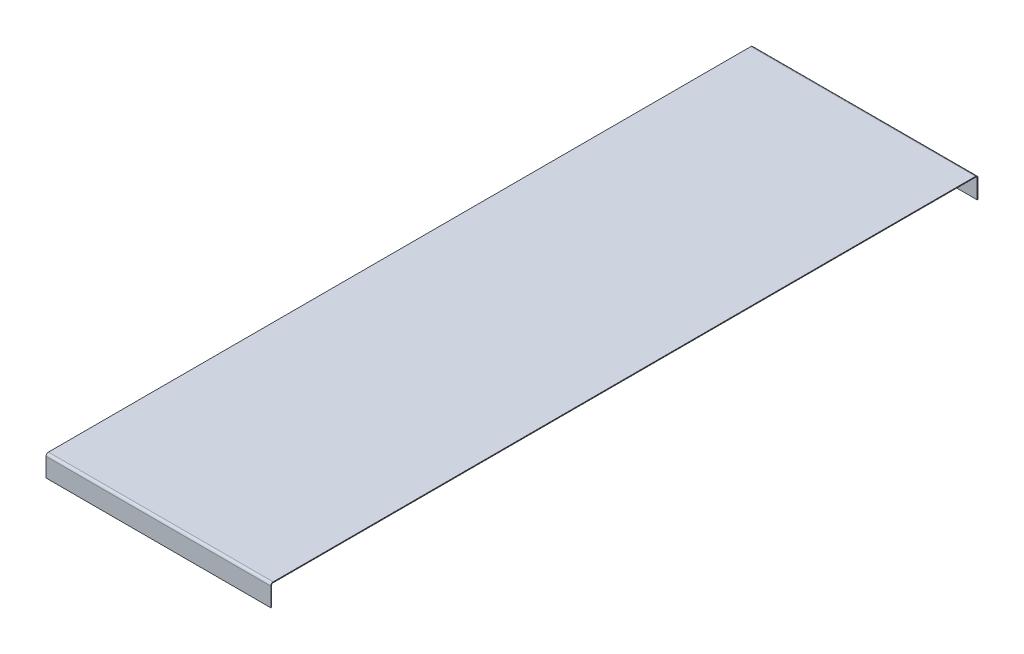
ISO-10303-21;
HEADER;
FILE_DESCRIPTION(('STEP AP214'),'2;1');
FILE_NAME('part.step','',(''),(''),'','','');
FILE_SCHEMA(('AUTOMOTIVE_DESIGN { 1 0 10303 214 1 1 1 1 }'));
ENDSEC;
DATA;
#1=APPLICATION_CONTEXT('core data for automotive mechanical design processes');
#2=APPLICATION_PROTOCOL_DEFINITION('international standard','automotive_design',2000,#1);
#3=PRODUCT_CONTEXT('',#1,'mechanical');
#4=PRODUCT('Part','Part','',(#3));
#5=PRODUCT_RELATED_PRODUCT_CATEGORY('part','',(#4));
#6=PRODUCT_DEFINITION_FORMATION('','',#4);
#7=PRODUCT_DEFINITION_CONTEXT('part definition',#1,'design');
#8=PRODUCT_DEFINITION('design','',#6,#7);
#9=PRODUCT_DEFINITION_SHAPE('','',#8);
#10=(LENGTH_UNIT() NAMED_UNIT(*) SI_UNIT(.MILLI.,.METRE.));
#11=(NAMED_UNIT(*) PLANE_ANGLE_UNIT() SI_UNIT($,.RADIAN.));
#12=(NAMED_UNIT(*) SI_UNIT($,.STERADIAN.) SOLID_ANGLE_UNIT());
#13=UNCERTAINTY_MEASURE_WITH_UNIT(LENGTH_MEASURE(1.E-05),#10,'distance_accuracy_value','');
#14=(GEOMETRIC_REPRESENTATION_CONTEXT(3) GLOBAL_UNCERTAINTY_ASSIGNED_CONTEXT((#13)) GLOBAL_UNIT_ASSIGNED_CONTEXT((#10,
#11,#12)) REPRESENTATION_CONTEXT('',''));
#15=CARTESIAN_POINT('',(0.,0.,0.));
#16=DIRECTION('',(0.,0.,1.));
#17=DIRECTION('',(1.,0.,0.));
#18=AXIS2_PLACEMENT_3D('',#15,#16,#17);
#19=CARTESIAN_POINT('',(0.,0.,0.));
#20=DIRECTION('',(0.,1.,0.));
#21=DIRECTION('',(0.,0.,1.));
#22=AXIS2_PLACEMENT_3D('',#19,#20,#21);
#23=PLANE('',#22);
#24=DIRECTION('',(0.,0.,1.));
#25=VECTOR('',#24,1.);
#26=CARTESIAN_POINT('',(104.619110259805,0.,147.476095846595));
#27=LINE('',#26,#25);
#28=CARTESIAN_POINT('',(104.619110259805,0.,-290.633904153406));
#29=VERTEX_POINT('',#28);
#30=CARTESIAN_POINT('',(104.619110259805,0.,145.976095846595));
#31=VERTEX_POINT('',#30);
#32=EDGE_CURVE('E174',#29,#31,#27,.T.);
#33=ORIENTED_EDGE('',*,*,#32,.F.);
#34=DIRECTION('',(-1.,0.,0.));
#35=VECTOR('',#34,1.);
#36=CARTESIAN_POINT('',(244.319110259805,0.,-290.633904153406));
#37=LINE('',#36,#35);
#38=CARTESIAN_POINT('',(244.319110259805,0.,-290.633904153406));
#39=VERTEX_POINT('',#38);
#40=EDGE_CURVE('E208',#29,#39,#37,.F.);
#41=ORIENTED_EDGE('',*,*,#40,.T.);
#42=DIRECTION('',(0.,0.,-1.));
#43=VECTOR('',#42,1.);
#44=CARTESIAN_POINT('',(244.319110259805,0.,147.476095846595));
#45=LINE('',#44,#43);
#46=CARTESIAN_POINT('',(244.319110259805,0.,145.976095846595));
#47=VERTEX_POINT('',#46);
#48=EDGE_CURVE('E169',#47,#39,#45,.T.);
#49=ORIENTED_EDGE('',*,*,#48,.F.);
#50=DIRECTION('',(1.,0.,0.));
#51=VECTOR('',#50,1.);
#52=CARTESIAN_POINT('',(104.619110259805,0.,145.976095846595));
#53=LINE('',#52,#51);
#54=EDGE_CURVE('E189',#47,#31,#53,.F.);
#55=ORIENTED_EDGE('',*,*,#54,.T.);
#56=EDGE_LOOP('',(#33,#41,#49,#55));
#57=FACE_BOUND('',#56,.T.);
#58=ADVANCED_FACE('F36',(#57),#23,.F.);
#59=CARTESIAN_POINT('',(244.319110259805,0.5,147.476095846595));
#60=DIRECTION('',(-1.,0.,0.));
#61=DIRECTION('',(0.,0.,1.));
#62=AXIS2_PLACEMENT_3D('',#59,#60,#61);
#63=PLANE('',#62);
#64=DIRECTION('',(0.,-1.,0.));
#65=VECTOR('',#64,1.);
#66=CARTESIAN_POINT('',(244.319110259805,0.5,-292.133904153406));
#67=LINE('',#66,#65);
#68=CARTESIAN_POINT('',(244.319110259805,-1.,-292.133904153406));
#69=VERTEX_POINT('',#68);
#70=CARTESIAN_POINT('',(244.319110259805,-12.7,-292.133904153406));
#71=VERTEX_POINT('',#70);
#72=EDGE_CURVE('E184',#69,#71,#67,.T.);
#73=ORIENTED_EDGE('',*,*,#72,.F.);
#74=CARTESIAN_POINT('',(244.319110259805,-1.,-290.633904153406));
#75=DIRECTION('',(-1.,0.,0.));
#76=DIRECTION('',(0.,0.,1.));
#77=AXIS2_PLACEMENT_3D('',#74,#75,#76);
#78=CIRCLE('',#77,1.5);
#79=CARTESIAN_POINT('',(244.319110259805,0.5,-290.633904153406));
#80=VERTEX_POINT('',#79);
#81=EDGE_CURVE('E11',#69,#80,#78,.F.);
#82=ORIENTED_EDGE('',*,*,#81,.T.);
#83=DIRECTION('',(0.,0.,-1.));
#84=VECTOR('',#83,1.);
#85=CARTESIAN_POINT('',(244.319110259805,0.5,147.476095846595));
#86=LINE('',#85,#84);
#87=CARTESIAN_POINT('',(244.319110259805,0.5,145.976095846595));
#88=VERTEX_POINT('',#87);
#89=EDGE_CURVE('E170',#88,#80,#86,.T.);
#90=ORIENTED_EDGE('',*,*,#89,.F.);
#91=CARTESIAN_POINT('',(244.319110259805,-1.,145.976095846595));
#92=DIRECTION('',(-1.,0.,0.));
#93=DIRECTION('',(0.,0.,1.));
#94=AXIS2_PLACEMENT_3D('',#91,#92,#93);
#95=CIRCLE('',#94,1.5);
#96=CARTESIAN_POINT('',(244.319110259805,-1.,147.476095846595));
#97=VERTEX_POINT('',#96);
#98=EDGE_CURVE('E199',#88,#97,#95,.F.);
#99=ORIENTED_EDGE('',*,*,#98,.T.);
#100=DIRECTION('',(0.,-1.,0.));
#101=VECTOR('',#100,1.);
#102=CARTESIAN_POINT('',(244.319110259805,0.5,147.476095846595));
#103=LINE('',#102,#101);
#104=CARTESIAN_POINT('',(244.319110259805,-12.7,147.476095846595));
#105=VERTEX_POINT('',#104);
#106=EDGE_CURVE('E176',#97,#105,#103,.T.);
#107=ORIENTED_EDGE('',*,*,#106,.T.);
#108=DIRECTION('',(0.,0.,1.));
#109=VECTOR('',#108,1.);
#110=CARTESIAN_POINT('',(244.319110259805,-12.7,147.476095846595));
#111=LINE('',#110,#109);
#112=CARTESIAN_POINT('',(244.319110259805,-12.7,146.976095846595));
#113=VERTEX_POINT('',#112);
#114=EDGE_CURVE('E149',#113,#105,#111,.T.);
#115=ORIENTED_EDGE('',*,*,#114,.F.);
#116=DIRECTION('',(0.,1.,0.));
#117=VECTOR('',#116,1.);
#118=CARTESIAN_POINT('',(244.319110259805,-12.7,146.976095846595));
#119=LINE('',#118,#117);
#120=CARTESIAN_POINT('',(244.319110259805,-1.,146.976095846595));
#121=VERTEX_POINT('',#120);
#122=EDGE_CURVE('E163',#113,#121,#119,.T.);
#123=ORIENTED_EDGE('',*,*,#122,.T.);
#124=CARTESIAN_POINT('',(244.319110259805,-1.,145.976095846595));
#125=DIRECTION('',(-1.,0.,0.));
#126=DIRECTION('',(0.,0.,1.));
#127=AXIS2_PLACEMENT_3D('',#124,#125,#126);
#128=CIRCLE('',#127,1.);
#129=EDGE_CURVE('E192',#121,#47,#128,.T.);
#130=ORIENTED_EDGE('',*,*,#129,.T.);
#131=ORIENTED_EDGE('',*,*,#48,.T.);
#132=CARTESIAN_POINT('',(244.319110259805,-1.,-290.633904153406));
#133=DIRECTION('',(-1.,0.,0.));
#134=DIRECTION('',(0.,0.,1.));
#135=AXIS2_PLACEMENT_3D('',#132,#133,#134);
#136=CIRCLE('',#135,1.);
#137=CARTESIAN_POINT('',(244.319110259805,-1.,-291.633904153406));
#138=VERTEX_POINT('',#137);
#139=EDGE_CURVE('E148',#39,#138,#136,.T.);
#140=ORIENTED_EDGE('',*,*,#139,.T.);
#141=DIRECTION('',(0.,1.,0.));
#142=VECTOR('',#141,1.);
#143=CARTESIAN_POINT('',(244.319110259805,-12.7,-291.633904153406));
#144=LINE('',#143,#142);
#145=CARTESIAN_POINT('',(244.319110259805,-12.7,-291.633904153406));
#146=VERTEX_POINT('',#145);
#147=EDGE_CURVE('E128',#146,#138,#144,.T.);
#148=ORIENTED_EDGE('',*,*,#147,.F.);
#149=DIRECTION('',(0.,0.,1.));
#150=VECTOR('',#149,1.);
#151=CARTESIAN_POINT('',(244.319110259805,-12.7,-292.133904153406));
#152=LINE('',#151,#150);
#153=EDGE_CURVE('E136',#71,#146,#152,.T.);
#154=ORIENTED_EDGE('',*,*,#153,.F.);
#155=EDGE_LOOP('',(#73,#82,#90,#99,#107,#115,#123,#130,#131,#140,#148,#154));
#156=FACE_BOUND('',#155,.T.);
#157=ADVANCED_FACE('F145',(#156),#63,.F.);
#158=CARTESIAN_POINT('',(244.319110259805,0.5,-292.133904153406));
#159=DIRECTION('',(0.,0.,1.));
#160=DIRECTION('',(1.,0.,0.));
#161=AXIS2_PLACEMENT_3D('',#158,#159,#160);
#162=PLANE('',#161);
#163=DIRECTION('',(0.,-1.,0.));
#164=VECTOR('',#163,1.);
#165=CARTESIAN_POINT('',(104.619110259805,0.5,-292.133904153406));
#166=LINE('',#165,#164);
#167=CARTESIAN_POINT('',(104.619110259805,-1.,-292.133904153406));
#168=VERTEX_POINT('',#167);
#169=CARTESIAN_POINT('',(104.619110259805,-12.7,-292.133904153406));
#170=VERTEX_POINT('',#169);
#171=EDGE_CURVE('E182',#168,#170,#166,.T.);
#172=ORIENTED_EDGE('',*,*,#171,.F.);
#173=DIRECTION('',(-1.,0.,0.));
#174=VECTOR('',#173,1.);
#175=CARTESIAN_POINT('',(244.319110259805,-1.,-292.133904153406));
#176=LINE('',#175,#174);
#177=EDGE_CURVE('E44',#168,#69,#176,.F.);
#178=ORIENTED_EDGE('',*,*,#177,.T.);
#179=ORIENTED_EDGE('',*,*,#72,.T.);
#180=DIRECTION('',(1.,0.,0.));
#181=VECTOR('',#180,1.);
#182=CARTESIAN_POINT('',(244.319110259805,-12.7,-292.133904153406));
#183=LINE('',#182,#181);
#184=EDGE_CURVE('E142',#170,#71,#183,.T.);
#185=ORIENTED_EDGE('',*,*,#184,.F.);
#186=EDGE_LOOP('',(#172,#178,#179,#185));
#187=FACE_BOUND('',#186,.T.);
#188=ADVANCED_FACE('F243',(#187),#162,.F.);
#189=CARTESIAN_POINT('',(104.619110259805,0.5,147.476095846595));
#190=DIRECTION('',(1.,0.,0.));
#191=DIRECTION('',(0.,0.,-1.));
#192=AXIS2_PLACEMENT_3D('',#189,#190,#191);
#193=PLANE('',#192);
#194=DIRECTION('',(0.,0.,1.));
#195=VECTOR('',#194,1.);
#196=CARTESIAN_POINT('',(104.619110259805,0.5,147.476095846595));
#197=LINE('',#196,#195);
#198=CARTESIAN_POINT('',(104.619110259805,0.5,-290.633904153406));
#199=VERTEX_POINT('',#198);
#200=CARTESIAN_POINT('',(104.619110259805,0.5,145.976095846595));
#201=VERTEX_POINT('',#200);
#202=EDGE_CURVE('E173',#199,#201,#197,.T.);
#203=ORIENTED_EDGE('',*,*,#202,.F.);
#204=CARTESIAN_POINT('',(104.619110259805,-1.,-290.633904153406));
#205=DIRECTION('',(1.,0.,0.));
#206=DIRECTION('',(0.,0.,-1.));
#207=AXIS2_PLACEMENT_3D('',#204,#205,#206);
#208=CIRCLE('',#207,1.5);
#209=EDGE_CURVE('E58',#199,#168,#208,.F.);
#210=ORIENTED_EDGE('',*,*,#209,.T.);
#211=ORIENTED_EDGE('',*,*,#171,.T.);
#212=DIRECTION('',(0.,0.,-1.));
#213=VECTOR('',#212,1.);
#214=CARTESIAN_POINT('',(104.619110259805,-12.7,-292.133904153406));
#215=LINE('',#214,#213);
#216=CARTESIAN_POINT('',(104.619110259805,-12.7,-291.633904153406));
#217=VERTEX_POINT('',#216);
#218=EDGE_CURVE('E135',#217,#170,#215,.T.);
#219=ORIENTED_EDGE('',*,*,#218,.F.);
#220=DIRECTION('',(0.,1.,0.));
#221=VECTOR('',#220,1.);
#222=CARTESIAN_POINT('',(104.619110259805,-12.7,-291.633904153406));
#223=LINE('',#222,#221);
#224=CARTESIAN_POINT('',(104.619110259805,-1.,-291.633904153406));
#225=VERTEX_POINT('',#224);
#226=EDGE_CURVE('E131',#217,#225,#223,.T.);
#227=ORIENTED_EDGE('',*,*,#226,.T.);
#228=CARTESIAN_POINT('',(104.619110259805,-1.,-290.633904153406));
#229=DIRECTION('',(1.,0.,0.));
#230=DIRECTION('',(0.,0.,-1.));
#231=AXIS2_PLACEMENT_3D('',#228,#229,#230);
#232=CIRCLE('',#231,1.);
#233=EDGE_CURVE('E210',#225,#29,#232,.T.);
#234=ORIENTED_EDGE('',*,*,#233,.T.);
#235=ORIENTED_EDGE('',*,*,#32,.T.);
#236=CARTESIAN_POINT('',(104.619110259805,-1.,145.976095846595));
#237=DIRECTION('',(1.,0.,0.));
#238=DIRECTION('',(0.,0.,-1.));
#239=AXIS2_PLACEMENT_3D('',#236,#237,#238);
#240=CIRCLE('',#239,1.);
#241=CARTESIAN_POINT('',(104.619110259805,-1.,146.976095846595));
#242=VERTEX_POINT('',#241);
#243=EDGE_CURVE('E194',#31,#242,#240,.T.);
#244=ORIENTED_EDGE('',*,*,#243,.T.);
#245=DIRECTION('',(0.,1.,0.));
#246=VECTOR('',#245,1.);
#247=CARTESIAN_POINT('',(104.619110259805,-12.7,146.976095846595));
#248=LINE('',#247,#246);
#249=CARTESIAN_POINT('',(104.619110259805,-12.7,146.976095846595));
#250=VERTEX_POINT('',#249);
#251=EDGE_CURVE('E166',#250,#242,#248,.T.);
#252=ORIENTED_EDGE('',*,*,#251,.F.);
#253=DIRECTION('',(0.,0.,-1.));
#254=VECTOR('',#253,1.);
#255=CARTESIAN_POINT('',(104.619110259805,-12.7,147.476095846595));
#256=LINE('',#255,#254);
#257=CARTESIAN_POINT('',(104.619110259805,-12.7,147.476095846595));
#258=VERTEX_POINT('',#257);
#259=EDGE_CURVE('E159',#258,#250,#256,.T.);
#260=ORIENTED_EDGE('',*,*,#259,.F.);
#261=DIRECTION('',(0.,-1.,0.));
#262=VECTOR('',#261,1.);
#263=CARTESIAN_POINT('',(104.619110259805,0.5,147.476095846595));
#264=LINE('',#263,#262);
#265=CARTESIAN_POINT('',(104.619110259805,-1.,147.476095846595));
#266=VERTEX_POINT('',#265);
#267=EDGE_CURVE('E180',#266,#258,#264,.T.);
#268=ORIENTED_EDGE('',*,*,#267,.F.);
#269=CARTESIAN_POINT('',(104.619110259805,-1.,145.976095846595));
#270=DIRECTION('',(1.,0.,0.));
#271=DIRECTION('',(0.,0.,-1.));
#272=AXIS2_PLACEMENT_3D('',#269,#270,#271);
#273=CIRCLE('',#272,1.5);
#274=EDGE_CURVE('E203',#266,#201,#273,.F.);
#275=ORIENTED_EDGE('',*,*,#274,.T.);
#276=EDGE_LOOP('',(#203,#210,#211,#219,#227,#234,#235,#244,#252,#260,#268,#275));
#277=FACE_BOUND('',#276,.T.);
#278=ADVANCED_FACE('F222',(#277),#193,.F.);
#279=CARTESIAN_POINT('',(244.319110259805,0.5,147.476095846595));
#280=DIRECTION('',(0.,0.,-1.));
#281=DIRECTION('',(-1.,0.,0.));
#282=AXIS2_PLACEMENT_3D('',#279,#280,#281);
#283=PLANE('',#282);
#284=ORIENTED_EDGE('',*,*,#106,.F.);
#285=DIRECTION('',(1.,0.,0.));
#286=VECTOR('',#285,1.);
#287=CARTESIAN_POINT('',(104.619110259805,-1.,147.476095846595));
#288=LINE('',#287,#286);
#289=EDGE_CURVE('E201',#97,#266,#288,.F.);
#290=ORIENTED_EDGE('',*,*,#289,.T.);
#291=ORIENTED_EDGE('',*,*,#267,.T.);
#292=DIRECTION('',(-1.,0.,0.));
#293=VECTOR('',#292,1.);
#294=CARTESIAN_POINT('',(244.319110259805,-12.7,147.476095846595));
#295=LINE('',#294,#293);
#296=EDGE_CURVE('E152',#105,#258,#295,.T.);
#297=ORIENTED_EDGE('',*,*,#296,.F.);
#298=EDGE_LOOP('',(#284,#290,#291,#297));
#299=FACE_BOUND('',#298,.T.);
#300=ADVANCED_FACE('F249',(#299),#283,.F.);
#301=CARTESIAN_POINT('',(0.,0.5,0.));
#302=DIRECTION('',(0.,1.,0.));
#303=DIRECTION('',(0.,0.,1.));
#304=AXIS2_PLACEMENT_3D('',#301,#302,#303);
#305=PLANE('',#304);
#306=ORIENTED_EDGE('',*,*,#89,.T.);
#307=DIRECTION('',(-1.,0.,0.));
#308=VECTOR('',#307,1.);
#309=CARTESIAN_POINT('',(104.619110259805,0.5,-290.633904153406));
#310=LINE('',#309,#308);
#311=EDGE_CURVE('E213',#80,#199,#310,.T.);
#312=ORIENTED_EDGE('',*,*,#311,.T.);
#313=ORIENTED_EDGE('',*,*,#202,.T.);
#314=DIRECTION('',(1.,0.,0.));
#315=VECTOR('',#314,1.);
#316=CARTESIAN_POINT('',(244.319110259805,0.5,145.976095846595));
#317=LINE('',#316,#315);
#318=EDGE_CURVE('E196',#201,#88,#317,.T.);
#319=ORIENTED_EDGE('',*,*,#318,.T.);
#320=EDGE_LOOP('',(#306,#312,#313,#319));
#321=FACE_BOUND('',#320,.T.);
#322=ADVANCED_FACE('F218',(#321),#305,.T.);
#323=CARTESIAN_POINT('',(244.319110259805,-12.7,146.976095846595));
#324=DIRECTION('',(0.,0.,1.));
#325=DIRECTION('',(1.,0.,0.));
#326=AXIS2_PLACEMENT_3D('',#323,#324,#325);
#327=PLANE('',#326);
#328=ORIENTED_EDGE('',*,*,#251,.T.);
#329=DIRECTION('',(1.,0.,0.));
#330=VECTOR('',#329,1.);
#331=CARTESIAN_POINT('',(244.319110259805,-1.,146.976095846595));
#332=LINE('',#331,#330);
#333=EDGE_CURVE('E186',#242,#121,#332,.T.);
#334=ORIENTED_EDGE('',*,*,#333,.T.);
#335=ORIENTED_EDGE('',*,*,#122,.F.);
#336=DIRECTION('',(1.,0.,0.));
#337=VECTOR('',#336,1.);
#338=CARTESIAN_POINT('',(244.319110259805,-12.7,146.976095846595));
#339=LINE('',#338,#337);
#340=EDGE_CURVE('E161',#250,#113,#339,.T.);
#341=ORIENTED_EDGE('',*,*,#340,.F.);
#342=EDGE_LOOP('',(#328,#334,#335,#341));
#343=FACE_BOUND('',#342,.T.);
#344=ADVANCED_FACE('F273',(#343),#327,.F.);
#345=CARTESIAN_POINT('',(0.,-12.7,0.));
#346=DIRECTION('',(0.,1.,0.));
#347=DIRECTION('',(0.,0.,1.));
#348=AXIS2_PLACEMENT_3D('',#345,#346,#347);
#349=PLANE('',#348);
#350=ORIENTED_EDGE('',*,*,#114,.T.);
#351=ORIENTED_EDGE('',*,*,#296,.T.);
#352=ORIENTED_EDGE('',*,*,#259,.T.);
#353=ORIENTED_EDGE('',*,*,#340,.T.);
#354=EDGE_LOOP('',(#350,#351,#352,#353));
#355=FACE_BOUND('',#354,.T.);
#356=ADVANCED_FACE('F260',(#355),#349,.F.);
#357=CARTESIAN_POINT('',(244.319110259805,-1.,145.976095846595));
#358=DIRECTION('',(-1.,0.,0.));
#359=DIRECTION('',(0.,0.,1.));
#360=AXIS2_PLACEMENT_3D('',#357,#358,#359);
#361=CYLINDRICAL_SURFACE('',#360,1.);
#362=ORIENTED_EDGE('',*,*,#243,.F.);
#363=ORIENTED_EDGE('',*,*,#54,.F.);
#364=ORIENTED_EDGE('',*,*,#129,.F.);
#365=ORIENTED_EDGE('',*,*,#333,.F.);
#366=EDGE_LOOP('',(#362,#363,#364,#365));
#367=FACE_BOUND('',#366,.T.);
#368=ADVANCED_FACE('F257',(#367),#361,.F.);
#369=CARTESIAN_POINT('',(0.,-1.,145.976095846595));
#370=DIRECTION('',(-1.,0.,0.));
#371=DIRECTION('',(0.,0.,1.));
#372=AXIS2_PLACEMENT_3D('',#369,#370,#371);
#373=CYLINDRICAL_SURFACE('',#372,1.5);
#374=ORIENTED_EDGE('',*,*,#274,.F.);
#375=ORIENTED_EDGE('',*,*,#289,.F.);
#376=ORIENTED_EDGE('',*,*,#98,.F.);
#377=ORIENTED_EDGE('',*,*,#318,.F.);
#378=EDGE_LOOP('',(#374,#375,#376,#377));
#379=FACE_BOUND('',#378,.T.);
#380=ADVANCED_FACE('F229',(#379),#373,.T.);
#381=CARTESIAN_POINT('',(244.319110259805,-12.7,-291.633904153406));
#382=DIRECTION('',(0.,0.,-1.));
#383=DIRECTION('',(-1.,0.,0.));
#384=AXIS2_PLACEMENT_3D('',#381,#382,#383);
#385=PLANE('',#384);
#386=ORIENTED_EDGE('',*,*,#147,.T.);
#387=DIRECTION('',(-1.,0.,0.));
#388=VECTOR('',#387,1.);
#389=CARTESIAN_POINT('',(104.619110259805,-1.,-291.633904153406));
#390=LINE('',#389,#388);
#391=EDGE_CURVE('E206',#138,#225,#390,.T.);
#392=ORIENTED_EDGE('',*,*,#391,.T.);
#393=ORIENTED_EDGE('',*,*,#226,.F.);
#394=DIRECTION('',(-1.,0.,0.));
#395=VECTOR('',#394,1.);
#396=CARTESIAN_POINT('',(244.319110259805,-12.7,-291.633904153406));
#397=LINE('',#396,#395);
#398=EDGE_CURVE('E123',#146,#217,#397,.T.);
#399=ORIENTED_EDGE('',*,*,#398,.F.);
#400=EDGE_LOOP('',(#386,#392,#393,#399));
#401=FACE_BOUND('',#400,.T.);
#402=ADVANCED_FACE('F125',(#401),#385,.F.);
#403=CARTESIAN_POINT('',(0.,-12.7,0.));
#404=DIRECTION('',(0.,-1.,0.));
#405=DIRECTION('',(0.,0.,-1.));
#406=AXIS2_PLACEMENT_3D('',#403,#404,#405);
#407=PLANE('',#406);
#408=ORIENTED_EDGE('',*,*,#153,.T.);
#409=ORIENTED_EDGE('',*,*,#398,.T.);
#410=ORIENTED_EDGE('',*,*,#218,.T.);
#411=ORIENTED_EDGE('',*,*,#184,.T.);
#412=EDGE_LOOP('',(#408,#409,#410,#411));
#413=FACE_BOUND('',#412,.T.);
#414=ADVANCED_FACE('F140',(#413),#407,.T.);
#415=CARTESIAN_POINT('',(244.319110259805,-1.,-290.633904153406));
#416=DIRECTION('',(1.,0.,0.));
#417=DIRECTION('',(0.,0.,-1.));
#418=AXIS2_PLACEMENT_3D('',#415,#416,#417);
#419=CYLINDRICAL_SURFACE('',#418,1.);
#420=ORIENTED_EDGE('',*,*,#139,.F.);
#421=ORIENTED_EDGE('',*,*,#40,.F.);
#422=ORIENTED_EDGE('',*,*,#233,.F.);
#423=ORIENTED_EDGE('',*,*,#391,.F.);
#424=EDGE_LOOP('',(#420,#421,#422,#423));
#425=FACE_BOUND('',#424,.T.);
#426=ADVANCED_FACE('F232',(#425),#419,.F.);
#427=CARTESIAN_POINT('',(0.,-1.,-290.633904153406));
#428=DIRECTION('',(1.,0.,0.));
#429=DIRECTION('',(0.,0.,-1.));
#430=AXIS2_PLACEMENT_3D('',#427,#428,#429);
#431=CYLINDRICAL_SURFACE('',#430,1.5);
#432=ORIENTED_EDGE('',*,*,#81,.F.);
#433=ORIENTED_EDGE('',*,*,#177,.F.);
#434=ORIENTED_EDGE('',*,*,#209,.F.);
#435=ORIENTED_EDGE('',*,*,#311,.F.);
#436=EDGE_LOOP('',(#432,#433,#434,#435));
#437=FACE_BOUND('',#436,.T.);
#438=ADVANCED_FACE('F38',(#437),#431,.T.);
#439=CLOSED_SHELL('',(#58,#157,#188,#278,#300,#322,#344,#356,#368,#380,#402,#414,#426,#438));
#440=MANIFOLD_SOLID_BREP('B2',#439);
#441=ADVANCED_BREP_SHAPE_REPRESENTATION('',(#18,#440),#14);
#442=SHAPE_DEFINITION_REPRESENTATION(#9,#441);
ENDSEC;
END-ISO-10303-21;
